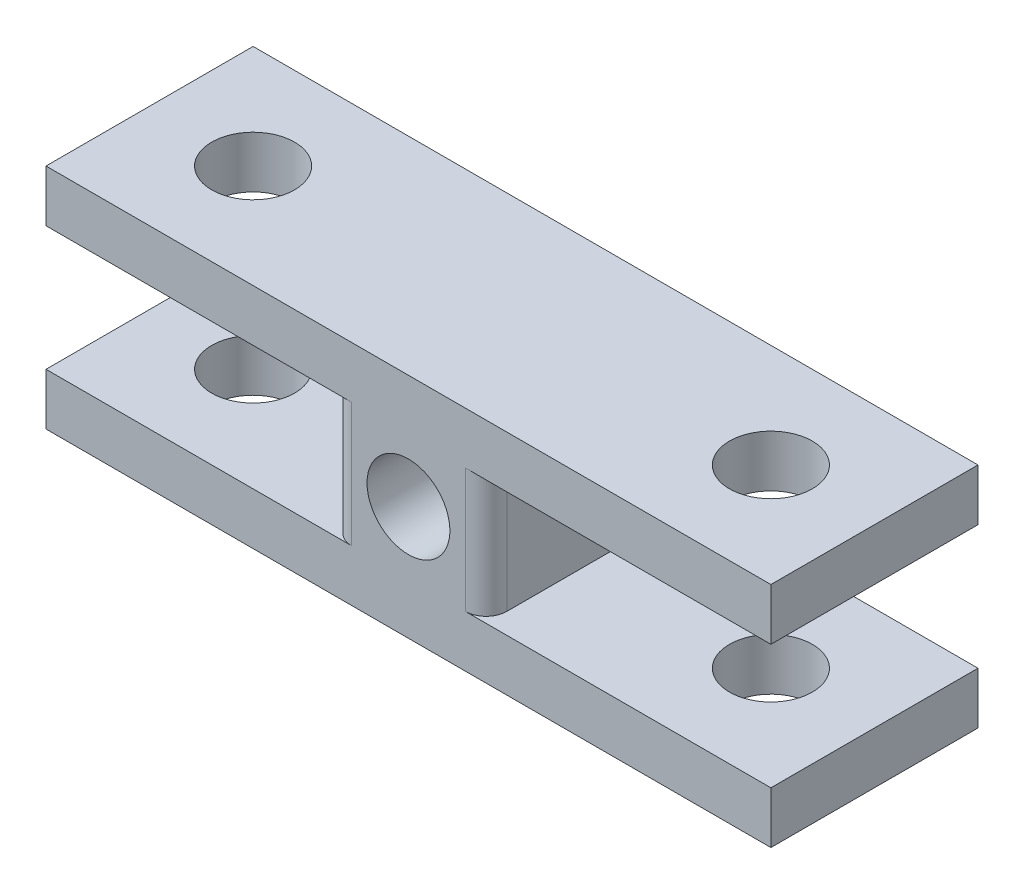
ISO-10303-21;
HEADER;
FILE_DESCRIPTION(('STEP AP214'),'2;1');
FILE_NAME('part.step','',(''),(''),'','','');
FILE_SCHEMA(('AUTOMOTIVE_DESIGN { 1 0 10303 214 1 1 1 1 }'));
ENDSEC;
DATA;
#1=APPLICATION_CONTEXT('core data for automotive mechanical design processes');
#2=APPLICATION_PROTOCOL_DEFINITION('international standard','automotive_design',2000,#1);
#3=PRODUCT_CONTEXT('',#1,'mechanical');
#4=PRODUCT('Part','Part','',(#3));
#5=PRODUCT_RELATED_PRODUCT_CATEGORY('part','',(#4));
#6=PRODUCT_DEFINITION_FORMATION('','',#4);
#7=PRODUCT_DEFINITION_CONTEXT('part definition',#1,'design');
#8=PRODUCT_DEFINITION('design','',#6,#7);
#9=PRODUCT_DEFINITION_SHAPE('','',#8);
#10=(LENGTH_UNIT() NAMED_UNIT(*) SI_UNIT(.MILLI.,.METRE.));
#11=(NAMED_UNIT(*) PLANE_ANGLE_UNIT() SI_UNIT($,.RADIAN.));
#12=(NAMED_UNIT(*) SI_UNIT($,.STERADIAN.) SOLID_ANGLE_UNIT());
#13=UNCERTAINTY_MEASURE_WITH_UNIT(LENGTH_MEASURE(1.E-05),#10,'distance_accuracy_value','');
#14=(GEOMETRIC_REPRESENTATION_CONTEXT(3) GLOBAL_UNCERTAINTY_ASSIGNED_CONTEXT((#13)) GLOBAL_UNIT_ASSIGNED_CONTEXT((#10,
#11,#12)) REPRESENTATION_CONTEXT('',''));
#15=CARTESIAN_POINT('',(0.,0.,0.));
#16=DIRECTION('',(0.,0.,1.));
#17=DIRECTION('',(1.,0.,0.));
#18=AXIS2_PLACEMENT_3D('',#15,#16,#17);
#19=CARTESIAN_POINT('',(0.,5.,0.));
#20=DIRECTION('',(0.,1.,0.));
#21=DIRECTION('',(0.,0.,1.));
#22=AXIS2_PLACEMENT_3D('',#19,#20,#21);
#23=PLANE('',#22);
#24=DIRECTION('',(0.,0.,-1.));
#25=VECTOR('',#24,1.);
#26=CARTESIAN_POINT('',(7.5,5.,10.));
#27=LINE('',#26,#25);
#28=CARTESIAN_POINT('',(7.5,5.,8.));
#29=VERTEX_POINT('',#28);
#30=CARTESIAN_POINT('',(7.5,5.,-8.));
#31=VERTEX_POINT('',#30);
#32=EDGE_CURVE('E222',#29,#31,#27,.T.);
#33=ORIENTED_EDGE('',*,*,#32,.F.);
#34=CARTESIAN_POINT('',(5.5,5.,8.));
#35=DIRECTION('',(0.,1.,0.));
#36=DIRECTION('',(0.,0.,1.));
#37=AXIS2_PLACEMENT_3D('',#34,#35,#36);
#38=CIRCLE('',#37,2.);
#39=CARTESIAN_POINT('',(5.5,5.,10.));
#40=VERTEX_POINT('',#39);
#41=EDGE_CURVE('E322',#29,#40,#38,.F.);
#42=ORIENTED_EDGE('',*,*,#41,.T.);
#43=DIRECTION('',(1.,0.,0.));
#44=VECTOR('',#43,1.);
#45=CARTESIAN_POINT('',(-35.,5.,10.));
#46=LINE('',#45,#44);
#47=CARTESIAN_POINT('',(35.,5.,10.));
#48=VERTEX_POINT('',#47);
#49=EDGE_CURVE('E258',#40,#48,#46,.T.);
#50=ORIENTED_EDGE('',*,*,#49,.T.);
#51=DIRECTION('',(0.,0.,-1.));
#52=VECTOR('',#51,1.);
#53=CARTESIAN_POINT('',(35.,5.,-10.));
#54=LINE('',#53,#52);
#55=CARTESIAN_POINT('',(35.,5.,-10.));
#56=VERTEX_POINT('',#55);
#57=EDGE_CURVE('E247',#48,#56,#54,.T.);
#58=ORIENTED_EDGE('',*,*,#57,.T.);
#59=DIRECTION('',(-1.,0.,0.));
#60=VECTOR('',#59,1.);
#61=CARTESIAN_POINT('',(-35.,5.,-10.));
#62=LINE('',#61,#60);
#63=CARTESIAN_POINT('',(5.5,5.,-10.));
#64=VERTEX_POINT('',#63);
#65=EDGE_CURVE('E252',#56,#64,#62,.T.);
#66=ORIENTED_EDGE('',*,*,#65,.T.);
#67=CARTESIAN_POINT('',(5.5,5.,-8.));
#68=DIRECTION('',(0.,1.,0.));
#69=DIRECTION('',(0.,0.,1.));
#70=AXIS2_PLACEMENT_3D('',#67,#68,#69);
#71=CIRCLE('',#70,2.);
#72=EDGE_CURVE('E47',#64,#31,#71,.F.);
#73=ORIENTED_EDGE('',*,*,#72,.T.);
#74=EDGE_LOOP('',(#33,#42,#50,#58,#66,#73));
#75=FACE_BOUND('',#74,.T.);
#76=CARTESIAN_POINT('',(25.,5.,0.));
#77=DIRECTION('',(0.,1.,0.));
#78=DIRECTION('',(0.,0.,-1.));
#79=AXIS2_PLACEMENT_3D('',#76,#77,#78);
#80=CIRCLE('',#79,4.);
#81=CARTESIAN_POINT('',(25.,5.,-4.));
#82=VERTEX_POINT('',#81);
#83=EDGE_CURVE('E231',#82,#82,#80,.T.);
#84=ORIENTED_EDGE('',*,*,#83,.F.);
#85=EDGE_LOOP('',(#84));
#86=FACE_BOUND('',#85,.T.);
#87=ADVANCED_FACE('F38',(#75,#86),#23,.T.);
#88=DIRECTION('',(0.,0.,1.));
#89=VECTOR('',#88,1.);
#90=CARTESIAN_POINT('',(-7.5,5.,10.));
#91=LINE('',#90,#89);
#92=CARTESIAN_POINT('',(-7.5,5.,-8.));
#93=VERTEX_POINT('',#92);
#94=CARTESIAN_POINT('',(-7.5,5.,8.));
#95=VERTEX_POINT('',#94);
#96=EDGE_CURVE('E226',#93,#95,#91,.T.);
#97=ORIENTED_EDGE('',*,*,#96,.F.);
#98=CARTESIAN_POINT('',(-5.5,5.,-8.));
#99=DIRECTION('',(0.,1.,0.));
#100=DIRECTION('',(0.,0.,1.));
#101=AXIS2_PLACEMENT_3D('',#98,#99,#100);
#102=CIRCLE('',#101,2.);
#103=CARTESIAN_POINT('',(-5.5,5.,-10.));
#104=VERTEX_POINT('',#103);
#105=EDGE_CURVE('E329',#93,#104,#102,.F.);
#106=ORIENTED_EDGE('',*,*,#105,.T.);
#107=CARTESIAN_POINT('',(-35.,5.,-10.));
#108=VERTEX_POINT('',#107);
#109=EDGE_CURVE('E54',#104,#108,#62,.T.);
#110=ORIENTED_EDGE('',*,*,#109,.T.);
#111=DIRECTION('',(0.,0.,1.));
#112=VECTOR('',#111,1.);
#113=CARTESIAN_POINT('',(-35.,5.,-10.));
#114=LINE('',#113,#112);
#115=CARTESIAN_POINT('',(-35.,5.,10.));
#116=VERTEX_POINT('',#115);
#117=EDGE_CURVE('E255',#108,#116,#114,.T.);
#118=ORIENTED_EDGE('',*,*,#117,.T.);
#119=CARTESIAN_POINT('',(-5.5,5.,10.));
#120=VERTEX_POINT('',#119);
#121=EDGE_CURVE('E259',#116,#120,#46,.T.);
#122=ORIENTED_EDGE('',*,*,#121,.T.);
#123=CARTESIAN_POINT('',(-5.5,5.,8.));
#124=DIRECTION('',(0.,1.,0.));
#125=DIRECTION('',(0.,0.,1.));
#126=AXIS2_PLACEMENT_3D('',#123,#124,#125);
#127=CIRCLE('',#126,2.);
#128=EDGE_CURVE('E315',#120,#95,#127,.F.);
#129=ORIENTED_EDGE('',*,*,#128,.T.);
#130=EDGE_LOOP('',(#97,#106,#110,#118,#122,#129));
#131=FACE_BOUND('',#130,.T.);
#132=CARTESIAN_POINT('',(-25.,5.,0.));
#133=DIRECTION('',(0.,1.,0.));
#134=DIRECTION('',(0.,0.,1.));
#135=AXIS2_PLACEMENT_3D('',#132,#133,#134);
#136=CIRCLE('',#135,4.);
#137=CARTESIAN_POINT('',(-25.,5.,4.));
#138=VERTEX_POINT('',#137);
#139=EDGE_CURVE('E239',#138,#138,#136,.T.);
#140=ORIENTED_EDGE('',*,*,#139,.F.);
#141=EDGE_LOOP('',(#140));
#142=FACE_BOUND('',#141,.T.);
#143=ADVANCED_FACE('F375',(#131,#142),#23,.T.);
#144=CARTESIAN_POINT('',(0.,0.,0.));
#145=DIRECTION('',(0.,1.,0.));
#146=DIRECTION('',(0.,0.,1.));
#147=AXIS2_PLACEMENT_3D('',#144,#145,#146);
#148=PLANE('',#147);
#149=DIRECTION('',(0.,0.,-1.));
#150=VECTOR('',#149,1.);
#151=CARTESIAN_POINT('',(35.,0.,-10.));
#152=LINE('',#151,#150);
#153=CARTESIAN_POINT('',(35.,0.,10.));
#154=VERTEX_POINT('',#153);
#155=CARTESIAN_POINT('',(35.,0.,-10.));
#156=VERTEX_POINT('',#155);
#157=EDGE_CURVE('E243',#154,#156,#152,.T.);
#158=ORIENTED_EDGE('',*,*,#157,.F.);
#159=DIRECTION('',(1.,0.,0.));
#160=VECTOR('',#159,1.);
#161=CARTESIAN_POINT('',(-35.,0.,10.));
#162=LINE('',#161,#160);
#163=CARTESIAN_POINT('',(-35.,0.,10.));
#164=VERTEX_POINT('',#163);
#165=EDGE_CURVE('E251',#164,#154,#162,.T.);
#166=ORIENTED_EDGE('',*,*,#165,.F.);
#167=DIRECTION('',(0.,0.,1.));
#168=VECTOR('',#167,1.);
#169=CARTESIAN_POINT('',(-35.,0.,-10.));
#170=LINE('',#169,#168);
#171=CARTESIAN_POINT('',(-35.,0.,-10.));
#172=VERTEX_POINT('',#171);
#173=EDGE_CURVE('E269',#172,#164,#170,.T.);
#174=ORIENTED_EDGE('',*,*,#173,.F.);
#175=DIRECTION('',(-1.,0.,0.));
#176=VECTOR('',#175,1.);
#177=CARTESIAN_POINT('',(-35.,0.,-10.));
#178=LINE('',#177,#176);
#179=EDGE_CURVE('E266',#156,#172,#178,.T.);
#180=ORIENTED_EDGE('',*,*,#179,.F.);
#181=EDGE_LOOP('',(#158,#166,#174,#180));
#182=FACE_BOUND('',#181,.T.);
#183=CARTESIAN_POINT('',(-25.,0.,0.));
#184=DIRECTION('',(0.,1.,0.));
#185=DIRECTION('',(0.,0.,1.));
#186=AXIS2_PLACEMENT_3D('',#183,#184,#185);
#187=CIRCLE('',#186,4.);
#188=CARTESIAN_POINT('',(-25.,0.,4.));
#189=VERTEX_POINT('',#188);
#190=EDGE_CURVE('E235',#189,#189,#187,.T.);
#191=ORIENTED_EDGE('',*,*,#190,.T.);
#192=EDGE_LOOP('',(#191));
#193=FACE_BOUND('',#192,.T.);
#194=CARTESIAN_POINT('',(25.,0.,0.));
#195=DIRECTION('',(0.,1.,0.));
#196=DIRECTION('',(0.,0.,-1.));
#197=AXIS2_PLACEMENT_3D('',#194,#195,#196);
#198=CIRCLE('',#197,4.);
#199=CARTESIAN_POINT('',(25.,0.,-4.));
#200=VERTEX_POINT('',#199);
#201=EDGE_CURVE('E230',#200,#200,#198,.T.);
#202=ORIENTED_EDGE('',*,*,#201,.T.);
#203=EDGE_LOOP('',(#202));
#204=FACE_BOUND('',#203,.T.);
#205=ADVANCED_FACE('F405',(#182,#193,#204),#148,.F.);
#206=CARTESIAN_POINT('',(35.,5.,-10.));
#207=DIRECTION('',(-1.,0.,0.));
#208=DIRECTION('',(0.,0.,1.));
#209=AXIS2_PLACEMENT_3D('',#206,#207,#208);
#210=PLANE('',#209);
#211=ORIENTED_EDGE('',*,*,#157,.T.);
#212=DIRECTION('',(0.,-1.,0.));
#213=VECTOR('',#212,1.);
#214=CARTESIAN_POINT('',(35.,5.,-10.));
#215=LINE('',#214,#213);
#216=EDGE_CURVE('E285',#56,#156,#215,.T.);
#217=ORIENTED_EDGE('',*,*,#216,.F.);
#218=ORIENTED_EDGE('',*,*,#57,.F.);
#219=DIRECTION('',(0.,-1.,0.));
#220=VECTOR('',#219,1.);
#221=CARTESIAN_POINT('',(35.,5.,10.));
#222=LINE('',#221,#220);
#223=EDGE_CURVE('E262',#48,#154,#222,.T.);
#224=ORIENTED_EDGE('',*,*,#223,.T.);
#225=EDGE_LOOP('',(#211,#217,#218,#224));
#226=FACE_BOUND('',#225,.T.);
#227=ADVANCED_FACE('F356',(#226),#210,.F.);
#228=CARTESIAN_POINT('',(-35.,5.,-10.));
#229=DIRECTION('',(0.,0.,1.));
#230=DIRECTION('',(1.,0.,0.));
#231=AXIS2_PLACEMENT_3D('',#228,#229,#230);
#232=PLANE('',#231);
#233=CARTESIAN_POINT('',(0.,11.,-10.));
#234=DIRECTION('',(0.,0.,-1.));
#235=DIRECTION('',(-1.,0.,0.));
#236=AXIS2_PLACEMENT_3D('',#233,#234,#235);
#237=CIRCLE('',#236,4.);
#238=CARTESIAN_POINT('',(-4.,11.,-10.));
#239=VERTEX_POINT('',#238);
#240=EDGE_CURVE('E629',#239,#239,#237,.T.);
#241=ORIENTED_EDGE('',*,*,#240,.F.);
#242=EDGE_LOOP('',(#241));
#243=FACE_BOUND('',#242,.T.);
#244=ORIENTED_EDGE('',*,*,#109,.F.);
#245=DIRECTION('',(0.,-1.,0.));
#246=VECTOR('',#245,1.);
#247=CARTESIAN_POINT('',(-5.5,5.,-10.));
#248=LINE('',#247,#246);
#249=CARTESIAN_POINT('',(-5.5,17.,-10.));
#250=VERTEX_POINT('',#249);
#251=EDGE_CURVE('E312',#104,#250,#248,.F.);
#252=ORIENTED_EDGE('',*,*,#251,.T.);
#253=DIRECTION('',(-1.,0.,0.));
#254=VECTOR('',#253,1.);
#255=CARTESIAN_POINT('',(-35.,17.,-10.));
#256=LINE('',#255,#254);
#257=CARTESIAN_POINT('',(-35.,17.,-10.));
#258=VERTEX_POINT('',#257);
#259=EDGE_CURVE('E62',#250,#258,#256,.T.);
#260=ORIENTED_EDGE('',*,*,#259,.T.);
#261=DIRECTION('',(0.,1.,0.));
#262=VECTOR('',#261,1.);
#263=CARTESIAN_POINT('',(-35.,17.,-10.));
#264=LINE('',#263,#262);
#265=CARTESIAN_POINT('',(-35.,22.,-10.));
#266=VERTEX_POINT('',#265);
#267=EDGE_CURVE('E210',#258,#266,#264,.T.);
#268=ORIENTED_EDGE('',*,*,#267,.T.);
#269=DIRECTION('',(-1.,0.,0.));
#270=VECTOR('',#269,1.);
#271=CARTESIAN_POINT('',(-35.,22.,-10.));
#272=LINE('',#271,#270);
#273=CARTESIAN_POINT('',(35.,22.,-10.));
#274=VERTEX_POINT('',#273);
#275=EDGE_CURVE('E181',#274,#266,#272,.T.);
#276=ORIENTED_EDGE('',*,*,#275,.F.);
#277=DIRECTION('',(0.,1.,0.));
#278=VECTOR('',#277,1.);
#279=CARTESIAN_POINT('',(35.,17.,-10.));
#280=LINE('',#279,#278);
#281=CARTESIAN_POINT('',(35.,17.,-10.));
#282=VERTEX_POINT('',#281);
#283=EDGE_CURVE('E198',#282,#274,#280,.T.);
#284=ORIENTED_EDGE('',*,*,#283,.F.);
#285=CARTESIAN_POINT('',(5.5,17.,-10.));
#286=VERTEX_POINT('',#285);
#287=EDGE_CURVE('E179',#282,#286,#256,.T.);
#288=ORIENTED_EDGE('',*,*,#287,.T.);
#289=DIRECTION('',(0.,-1.,0.));
#290=VECTOR('',#289,1.);
#291=CARTESIAN_POINT('',(5.5,5.,-10.));
#292=LINE('',#291,#290);
#293=EDGE_CURVE('E308',#286,#64,#292,.T.);
#294=ORIENTED_EDGE('',*,*,#293,.T.);
#295=ORIENTED_EDGE('',*,*,#65,.F.);
#296=ORIENTED_EDGE('',*,*,#216,.T.);
#297=ORIENTED_EDGE('',*,*,#179,.T.);
#298=DIRECTION('',(0.,-1.,0.));
#299=VECTOR('',#298,1.);
#300=CARTESIAN_POINT('',(-35.,5.,-10.));
#301=LINE('',#300,#299);
#302=EDGE_CURVE('E281',#108,#172,#301,.T.);
#303=ORIENTED_EDGE('',*,*,#302,.F.);
#304=EDGE_LOOP('',(#244,#252,#260,#268,#276,#284,#288,#294,#295,#296,#297,#303));
#305=FACE_BOUND('',#304,.T.);
#306=ADVANCED_FACE('F357',(#243,#305),#232,.F.);
#307=CARTESIAN_POINT('',(-35.,5.,-10.));
#308=DIRECTION('',(1.,0.,0.));
#309=DIRECTION('',(0.,0.,-1.));
#310=AXIS2_PLACEMENT_3D('',#307,#308,#309);
#311=PLANE('',#310);
#312=ORIENTED_EDGE('',*,*,#173,.T.);
#313=DIRECTION('',(0.,-1.,0.));
#314=VECTOR('',#313,1.);
#315=CARTESIAN_POINT('',(-35.,5.,10.));
#316=LINE('',#315,#314);
#317=EDGE_CURVE('E277',#116,#164,#316,.T.);
#318=ORIENTED_EDGE('',*,*,#317,.F.);
#319=ORIENTED_EDGE('',*,*,#117,.F.);
#320=ORIENTED_EDGE('',*,*,#302,.T.);
#321=EDGE_LOOP('',(#312,#318,#319,#320));
#322=FACE_BOUND('',#321,.T.);
#323=ADVANCED_FACE('F381',(#322),#311,.F.);
#324=CARTESIAN_POINT('',(-35.,5.,10.));
#325=DIRECTION('',(0.,0.,-1.));
#326=DIRECTION('',(-1.,0.,0.));
#327=AXIS2_PLACEMENT_3D('',#324,#325,#326);
#328=PLANE('',#327);
#329=CARTESIAN_POINT('',(0.,11.,10.));
#330=DIRECTION('',(0.,0.,-1.));
#331=DIRECTION('',(-1.,0.,0.));
#332=AXIS2_PLACEMENT_3D('',#329,#330,#331);
#333=CIRCLE('',#332,4.);
#334=CARTESIAN_POINT('',(-4.,11.,10.));
#335=VERTEX_POINT('',#334);
#336=EDGE_CURVE('E626',#335,#335,#333,.T.);
#337=ORIENTED_EDGE('',*,*,#336,.T.);
#338=EDGE_LOOP('',(#337));
#339=FACE_BOUND('',#338,.T.);
#340=DIRECTION('',(0.,-1.,0.));
#341=VECTOR('',#340,1.);
#342=CARTESIAN_POINT('',(-5.5,5.,10.));
#343=LINE('',#342,#341);
#344=CARTESIAN_POINT('',(-5.5,17.,10.));
#345=VERTEX_POINT('',#344);
#346=EDGE_CURVE('E291',#345,#120,#343,.T.);
#347=ORIENTED_EDGE('',*,*,#346,.T.);
#348=ORIENTED_EDGE('',*,*,#121,.F.);
#349=ORIENTED_EDGE('',*,*,#317,.T.);
#350=ORIENTED_EDGE('',*,*,#165,.T.);
#351=ORIENTED_EDGE('',*,*,#223,.F.);
#352=ORIENTED_EDGE('',*,*,#49,.F.);
#353=DIRECTION('',(0.,-1.,0.));
#354=VECTOR('',#353,1.);
#355=CARTESIAN_POINT('',(5.5,5.,10.));
#356=LINE('',#355,#354);
#357=CARTESIAN_POINT('',(5.5,17.,10.));
#358=VERTEX_POINT('',#357);
#359=EDGE_CURVE('E159',#40,#358,#356,.F.);
#360=ORIENTED_EDGE('',*,*,#359,.T.);
#361=DIRECTION('',(1.,0.,0.));
#362=VECTOR('',#361,1.);
#363=CARTESIAN_POINT('',(-35.,17.,10.));
#364=LINE('',#363,#362);
#365=CARTESIAN_POINT('',(35.,17.,10.));
#366=VERTEX_POINT('',#365);
#367=EDGE_CURVE('E151',#358,#366,#364,.T.);
#368=ORIENTED_EDGE('',*,*,#367,.T.);
#369=DIRECTION('',(0.,1.,0.));
#370=VECTOR('',#369,1.);
#371=CARTESIAN_POINT('',(35.,17.,10.));
#372=LINE('',#371,#370);
#373=CARTESIAN_POINT('',(35.,22.,10.));
#374=VERTEX_POINT('',#373);
#375=EDGE_CURVE('E156',#366,#374,#372,.T.);
#376=ORIENTED_EDGE('',*,*,#375,.T.);
#377=DIRECTION('',(1.,0.,0.));
#378=VECTOR('',#377,1.);
#379=CARTESIAN_POINT('',(-35.,22.,10.));
#380=LINE('',#379,#378);
#381=CARTESIAN_POINT('',(-35.,22.,10.));
#382=VERTEX_POINT('',#381);
#383=EDGE_CURVE('E201',#382,#374,#380,.T.);
#384=ORIENTED_EDGE('',*,*,#383,.F.);
#385=DIRECTION('',(0.,1.,0.));
#386=VECTOR('',#385,1.);
#387=CARTESIAN_POINT('',(-35.,17.,10.));
#388=LINE('',#387,#386);
#389=CARTESIAN_POINT('',(-35.,17.,10.));
#390=VERTEX_POINT('',#389);
#391=EDGE_CURVE('E176',#390,#382,#388,.T.);
#392=ORIENTED_EDGE('',*,*,#391,.F.);
#393=EDGE_CURVE('E164',#390,#345,#364,.T.);
#394=ORIENTED_EDGE('',*,*,#393,.T.);
#395=EDGE_LOOP('',(#347,#348,#349,#350,#351,#352,#360,#368,#376,#384,#392,#394));
#396=FACE_BOUND('',#395,.T.);
#397=ADVANCED_FACE('F154',(#339,#396),#328,.F.);
#398=CARTESIAN_POINT('',(-25.,5.,0.));
#399=DIRECTION('',(0.,-1.,0.));
#400=DIRECTION('',(0.,0.,-1.));
#401=AXIS2_PLACEMENT_3D('',#398,#399,#400);
#402=CYLINDRICAL_SURFACE('',#401,4.);
#403=ORIENTED_EDGE('',*,*,#139,.T.);
#404=EDGE_LOOP('',(#403));
#405=FACE_BOUND('',#404,.T.);
#406=ORIENTED_EDGE('',*,*,#190,.F.);
#407=EDGE_LOOP('',(#406));
#408=FACE_BOUND('',#407,.T.);
#409=ADVANCED_FACE('F408',(#405,#408),#402,.F.);
#410=CARTESIAN_POINT('',(25.,5.,0.));
#411=DIRECTION('',(0.,-1.,0.));
#412=DIRECTION('',(0.,0.,-1.));
#413=AXIS2_PLACEMENT_3D('',#410,#411,#412);
#414=CYLINDRICAL_SURFACE('',#413,4.);
#415=ORIENTED_EDGE('',*,*,#83,.T.);
#416=EDGE_LOOP('',(#415));
#417=FACE_BOUND('',#416,.T.);
#418=ORIENTED_EDGE('',*,*,#201,.F.);
#419=EDGE_LOOP('',(#418));
#420=FACE_BOUND('',#419,.T.);
#421=ADVANCED_FACE('F455',(#417,#420),#414,.F.);
#422=CARTESIAN_POINT('',(7.5,11.,10.));
#423=DIRECTION('',(-1.,0.,0.));
#424=DIRECTION('',(0.,0.,1.));
#425=AXIS2_PLACEMENT_3D('',#422,#423,#424);
#426=PLANE('',#425);
#427=DIRECTION('',(0.,0.,-1.));
#428=VECTOR('',#427,1.);
#429=CARTESIAN_POINT('',(7.5,17.,10.));
#430=LINE('',#429,#428);
#431=CARTESIAN_POINT('',(7.5,17.,8.));
#432=VERTEX_POINT('',#431);
#433=CARTESIAN_POINT('',(7.5,17.,-8.));
#434=VERTEX_POINT('',#433);
#435=EDGE_CURVE('E175',#432,#434,#430,.T.);
#436=ORIENTED_EDGE('',*,*,#435,.F.);
#437=DIRECTION('',(0.,-1.,0.));
#438=VECTOR('',#437,1.);
#439=CARTESIAN_POINT('',(7.5,11.,8.));
#440=LINE('',#439,#438);
#441=EDGE_CURVE('E304',#432,#29,#440,.T.);
#442=ORIENTED_EDGE('',*,*,#441,.T.);
#443=ORIENTED_EDGE('',*,*,#32,.T.);
#444=DIRECTION('',(0.,-1.,0.));
#445=VECTOR('',#444,1.);
#446=CARTESIAN_POINT('',(7.5,11.,-8.));
#447=LINE('',#446,#445);
#448=EDGE_CURVE('E301',#31,#434,#447,.F.);
#449=ORIENTED_EDGE('',*,*,#448,.T.);
#450=EDGE_LOOP('',(#436,#442,#443,#449));
#451=FACE_BOUND('',#450,.T.);
#452=ADVANCED_FACE('F344',(#451),#426,.F.);
#453=CARTESIAN_POINT('',(-7.5,11.,10.));
#454=DIRECTION('',(1.,0.,0.));
#455=DIRECTION('',(0.,0.,-1.));
#456=AXIS2_PLACEMENT_3D('',#453,#454,#455);
#457=PLANE('',#456);
#458=ORIENTED_EDGE('',*,*,#96,.T.);
#459=DIRECTION('',(0.,-1.,0.));
#460=VECTOR('',#459,1.);
#461=CARTESIAN_POINT('',(-7.5,11.,8.));
#462=LINE('',#461,#460);
#463=CARTESIAN_POINT('',(-7.5,17.,8.));
#464=VERTEX_POINT('',#463);
#465=EDGE_CURVE('E298',#95,#464,#462,.F.);
#466=ORIENTED_EDGE('',*,*,#465,.T.);
#467=DIRECTION('',(0.,0.,1.));
#468=VECTOR('',#467,1.);
#469=CARTESIAN_POINT('',(-7.5,17.,10.));
#470=LINE('',#469,#468);
#471=CARTESIAN_POINT('',(-7.5,17.,-8.));
#472=VERTEX_POINT('',#471);
#473=EDGE_CURVE('E218',#472,#464,#470,.T.);
#474=ORIENTED_EDGE('',*,*,#473,.F.);
#475=DIRECTION('',(0.,-1.,0.));
#476=VECTOR('',#475,1.);
#477=CARTESIAN_POINT('',(-7.5,11.,-8.));
#478=LINE('',#477,#476);
#479=EDGE_CURVE('E294',#472,#93,#478,.T.);
#480=ORIENTED_EDGE('',*,*,#479,.T.);
#481=EDGE_LOOP('',(#458,#466,#474,#480));
#482=FACE_BOUND('',#481,.T.);
#483=ADVANCED_FACE('F389',(#482),#457,.F.);
#484=CARTESIAN_POINT('',(0.,17.,0.));
#485=DIRECTION('',(0.,-1.,0.));
#486=DIRECTION('',(0.,0.,1.));
#487=AXIS2_PLACEMENT_3D('',#484,#485,#486);
#488=PLANE('',#487);
#489=CARTESIAN_POINT('',(25.,17.,0.));
#490=DIRECTION('',(0.,1.,0.));
#491=DIRECTION('',(0.,0.,-1.));
#492=AXIS2_PLACEMENT_3D('',#489,#490,#491);
#493=CIRCLE('',#492,4.);
#494=CARTESIAN_POINT('',(25.,17.,-4.));
#495=VERTEX_POINT('',#494);
#496=EDGE_CURVE('E618',#495,#495,#493,.T.);
#497=ORIENTED_EDGE('',*,*,#496,.T.);
#498=EDGE_LOOP('',(#497));
#499=FACE_BOUND('',#498,.T.);
#500=ORIENTED_EDGE('',*,*,#367,.F.);
#501=CARTESIAN_POINT('',(5.5,17.,8.));
#502=DIRECTION('',(0.,-1.,0.));
#503=DIRECTION('',(0.,0.,-1.));
#504=AXIS2_PLACEMENT_3D('',#501,#502,#503);
#505=CIRCLE('',#504,2.);
#506=EDGE_CURVE('E326',#358,#432,#505,.F.);
#507=ORIENTED_EDGE('',*,*,#506,.T.);
#508=ORIENTED_EDGE('',*,*,#435,.T.);
#509=CARTESIAN_POINT('',(5.5,17.,-8.));
#510=DIRECTION('',(0.,-1.,0.));
#511=DIRECTION('',(0.,0.,-1.));
#512=AXIS2_PLACEMENT_3D('',#509,#510,#511);
#513=CIRCLE('',#512,2.);
#514=EDGE_CURVE('E11',#434,#286,#513,.F.);
#515=ORIENTED_EDGE('',*,*,#514,.T.);
#516=ORIENTED_EDGE('',*,*,#287,.F.);
#517=DIRECTION('',(0.,0.,-1.));
#518=VECTOR('',#517,1.);
#519=CARTESIAN_POINT('',(35.,17.,-10.));
#520=LINE('',#519,#518);
#521=EDGE_CURVE('E165',#366,#282,#520,.T.);
#522=ORIENTED_EDGE('',*,*,#521,.F.);
#523=EDGE_LOOP('',(#500,#507,#508,#515,#516,#522));
#524=FACE_BOUND('',#523,.T.);
#525=ADVANCED_FACE('F178',(#499,#524),#488,.T.);
#526=CARTESIAN_POINT('',(35.,17.,-10.));
#527=DIRECTION('',(1.,0.,0.));
#528=DIRECTION('',(0.,0.,-1.));
#529=AXIS2_PLACEMENT_3D('',#526,#527,#528);
#530=PLANE('',#529);
#531=DIRECTION('',(0.,0.,-1.));
#532=VECTOR('',#531,1.);
#533=CARTESIAN_POINT('',(35.,22.,-10.));
#534=LINE('',#533,#532);
#535=EDGE_CURVE('E172',#374,#274,#534,.T.);
#536=ORIENTED_EDGE('',*,*,#535,.F.);
#537=ORIENTED_EDGE('',*,*,#375,.F.);
#538=ORIENTED_EDGE('',*,*,#521,.T.);
#539=ORIENTED_EDGE('',*,*,#283,.T.);
#540=EDGE_LOOP('',(#536,#537,#538,#539));
#541=FACE_BOUND('',#540,.T.);
#542=ADVANCED_FACE('F169',(#541),#530,.T.);
#543=CARTESIAN_POINT('',(-35.,17.,-10.));
#544=DIRECTION('',(-1.,0.,0.));
#545=DIRECTION('',(0.,0.,1.));
#546=AXIS2_PLACEMENT_3D('',#543,#544,#545);
#547=PLANE('',#546);
#548=DIRECTION('',(0.,0.,1.));
#549=VECTOR('',#548,1.);
#550=CARTESIAN_POINT('',(-35.,22.,-10.));
#551=LINE('',#550,#549);
#552=EDGE_CURVE('E185',#266,#382,#551,.T.);
#553=ORIENTED_EDGE('',*,*,#552,.F.);
#554=ORIENTED_EDGE('',*,*,#267,.F.);
#555=DIRECTION('',(0.,0.,1.));
#556=VECTOR('',#555,1.);
#557=CARTESIAN_POINT('',(-35.,17.,-10.));
#558=LINE('',#557,#556);
#559=EDGE_CURVE('E192',#258,#390,#558,.T.);
#560=ORIENTED_EDGE('',*,*,#559,.T.);
#561=ORIENTED_EDGE('',*,*,#391,.T.);
#562=EDGE_LOOP('',(#553,#554,#560,#561));
#563=FACE_BOUND('',#562,.T.);
#564=ADVANCED_FACE('F368',(#563),#547,.T.);
#565=CARTESIAN_POINT('',(-25.,17.,0.));
#566=DIRECTION('',(0.,1.,0.));
#567=DIRECTION('',(0.,0.,1.));
#568=AXIS2_PLACEMENT_3D('',#565,#566,#567);
#569=CIRCLE('',#568,4.);
#570=CARTESIAN_POINT('',(-25.,17.,4.));
#571=VERTEX_POINT('',#570);
#572=EDGE_CURVE('E202',#571,#571,#569,.T.);
#573=ORIENTED_EDGE('',*,*,#572,.T.);
#574=EDGE_LOOP('',(#573));
#575=FACE_BOUND('',#574,.T.);
#576=ORIENTED_EDGE('',*,*,#259,.F.);
#577=CARTESIAN_POINT('',(-5.5,17.,-8.));
#578=DIRECTION('',(0.,-1.,0.));
#579=DIRECTION('',(0.,0.,-1.));
#580=AXIS2_PLACEMENT_3D('',#577,#578,#579);
#581=CIRCLE('',#580,2.);
#582=EDGE_CURVE('E332',#250,#472,#581,.F.);
#583=ORIENTED_EDGE('',*,*,#582,.T.);
#584=ORIENTED_EDGE('',*,*,#473,.T.);
#585=CARTESIAN_POINT('',(-5.5,17.,8.));
#586=DIRECTION('',(0.,-1.,0.));
#587=DIRECTION('',(0.,0.,-1.));
#588=AXIS2_PLACEMENT_3D('',#585,#586,#587);
#589=CIRCLE('',#588,2.);
#590=EDGE_CURVE('E318',#464,#345,#589,.F.);
#591=ORIENTED_EDGE('',*,*,#590,.T.);
#592=ORIENTED_EDGE('',*,*,#393,.F.);
#593=ORIENTED_EDGE('',*,*,#559,.F.);
#594=EDGE_LOOP('',(#576,#583,#584,#591,#592,#593));
#595=FACE_BOUND('',#594,.T.);
#596=ADVANCED_FACE('F364',(#575,#595),#488,.T.);
#597=CARTESIAN_POINT('',(0.,22.,0.));
#598=DIRECTION('',(0.,-1.,0.));
#599=DIRECTION('',(0.,0.,1.));
#600=AXIS2_PLACEMENT_3D('',#597,#598,#599);
#601=PLANE('',#600);
#602=CARTESIAN_POINT('',(25.,22.,0.));
#603=DIRECTION('',(0.,1.,0.));
#604=DIRECTION('',(0.,0.,-1.));
#605=AXIS2_PLACEMENT_3D('',#602,#603,#604);
#606=CIRCLE('',#605,4.);
#607=CARTESIAN_POINT('',(25.,22.,-4.));
#608=VERTEX_POINT('',#607);
#609=EDGE_CURVE('E620',#608,#608,#606,.T.);
#610=ORIENTED_EDGE('',*,*,#609,.F.);
#611=EDGE_LOOP('',(#610));
#612=FACE_BOUND('',#611,.T.);
#613=CARTESIAN_POINT('',(-25.,22.,0.));
#614=DIRECTION('',(0.,1.,0.));
#615=DIRECTION('',(0.,0.,1.));
#616=AXIS2_PLACEMENT_3D('',#613,#614,#615);
#617=CIRCLE('',#616,4.);
#618=CARTESIAN_POINT('',(-25.,22.,4.));
#619=VERTEX_POINT('',#618);
#620=EDGE_CURVE('E188',#619,#619,#617,.T.);
#621=ORIENTED_EDGE('',*,*,#620,.F.);
#622=EDGE_LOOP('',(#621));
#623=FACE_BOUND('',#622,.T.);
#624=ORIENTED_EDGE('',*,*,#535,.T.);
#625=ORIENTED_EDGE('',*,*,#275,.T.);
#626=ORIENTED_EDGE('',*,*,#552,.T.);
#627=ORIENTED_EDGE('',*,*,#383,.T.);
#628=EDGE_LOOP('',(#624,#625,#626,#627));
#629=FACE_BOUND('',#628,.T.);
#630=ADVANCED_FACE('F360',(#612,#623,#629),#601,.F.);
#631=CARTESIAN_POINT('',(-25.,17.,0.));
#632=DIRECTION('',(0.,1.,0.));
#633=DIRECTION('',(0.,0.,1.));
#634=AXIS2_PLACEMENT_3D('',#631,#632,#633);
#635=CYLINDRICAL_SURFACE('',#634,4.);
#636=ORIENTED_EDGE('',*,*,#572,.F.);
#637=EDGE_LOOP('',(#636));
#638=FACE_BOUND('',#637,.T.);
#639=ORIENTED_EDGE('',*,*,#620,.T.);
#640=EDGE_LOOP('',(#639));
#641=FACE_BOUND('',#640,.T.);
#642=ADVANCED_FACE('F433',(#638,#641),#635,.F.);
#643=CARTESIAN_POINT('',(25.,17.,0.));
#644=DIRECTION('',(0.,1.,0.));
#645=DIRECTION('',(0.,0.,1.));
#646=AXIS2_PLACEMENT_3D('',#643,#644,#645);
#647=CYLINDRICAL_SURFACE('',#646,4.);
#648=ORIENTED_EDGE('',*,*,#496,.F.);
#649=EDGE_LOOP('',(#648));
#650=FACE_BOUND('',#649,.T.);
#651=ORIENTED_EDGE('',*,*,#609,.T.);
#652=EDGE_LOOP('',(#651));
#653=FACE_BOUND('',#652,.T.);
#654=ADVANCED_FACE('F428',(#650,#653),#647,.F.);
#655=CARTESIAN_POINT('',(0.,11.,10.));
#656=DIRECTION('',(0.,0.,-1.));
#657=DIRECTION('',(-1.,0.,0.));
#658=AXIS2_PLACEMENT_3D('',#655,#656,#657);
#659=CYLINDRICAL_SURFACE('',#658,4.);
#660=ORIENTED_EDGE('',*,*,#336,.F.);
#661=EDGE_LOOP('',(#660));
#662=FACE_BOUND('',#661,.T.);
#663=ORIENTED_EDGE('',*,*,#240,.T.);
#664=EDGE_LOOP('',(#663));
#665=FACE_BOUND('',#664,.T.);
#666=ADVANCED_FACE('F424',(#662,#665),#659,.F.);
#667=CARTESIAN_POINT('',(-5.5,5.,8.));
#668=DIRECTION('',(0.,-1.,0.));
#669=DIRECTION('',(0.,0.,-1.));
#670=AXIS2_PLACEMENT_3D('',#667,#668,#669);
#671=CYLINDRICAL_SURFACE('',#670,2.);
#672=ORIENTED_EDGE('',*,*,#590,.F.);
#673=ORIENTED_EDGE('',*,*,#465,.F.);
#674=ORIENTED_EDGE('',*,*,#128,.F.);
#675=ORIENTED_EDGE('',*,*,#346,.F.);
#676=EDGE_LOOP('',(#672,#673,#674,#675));
#677=FACE_BOUND('',#676,.T.);
#678=ADVANCED_FACE('F386',(#677),#671,.T.);
#679=CARTESIAN_POINT('',(5.5,11.,8.));
#680=DIRECTION('',(0.,-1.,0.));
#681=DIRECTION('',(0.,0.,-1.));
#682=AXIS2_PLACEMENT_3D('',#679,#680,#681);
#683=CYLINDRICAL_SURFACE('',#682,2.);
#684=ORIENTED_EDGE('',*,*,#506,.F.);
#685=ORIENTED_EDGE('',*,*,#359,.F.);
#686=ORIENTED_EDGE('',*,*,#41,.F.);
#687=ORIENTED_EDGE('',*,*,#441,.F.);
#688=EDGE_LOOP('',(#684,#685,#686,#687));
#689=FACE_BOUND('',#688,.T.);
#690=ADVANCED_FACE('F348',(#689),#683,.T.);
#691=CARTESIAN_POINT('',(-5.5,11.,-8.));
#692=DIRECTION('',(0.,-1.,0.));
#693=DIRECTION('',(0.,0.,-1.));
#694=AXIS2_PLACEMENT_3D('',#691,#692,#693);
#695=CYLINDRICAL_SURFACE('',#694,2.);
#696=ORIENTED_EDGE('',*,*,#582,.F.);
#697=ORIENTED_EDGE('',*,*,#251,.F.);
#698=ORIENTED_EDGE('',*,*,#105,.F.);
#699=ORIENTED_EDGE('',*,*,#479,.F.);
#700=EDGE_LOOP('',(#696,#697,#698,#699));
#701=FACE_BOUND('',#700,.T.);
#702=ADVANCED_FACE('F392',(#701),#695,.T.);
#703=CARTESIAN_POINT('',(5.5,5.,-8.));
#704=DIRECTION('',(0.,-1.,0.));
#705=DIRECTION('',(0.,0.,-1.));
#706=AXIS2_PLACEMENT_3D('',#703,#704,#705);
#707=CYLINDRICAL_SURFACE('',#706,2.);
#708=ORIENTED_EDGE('',*,*,#514,.F.);
#709=ORIENTED_EDGE('',*,*,#448,.F.);
#710=ORIENTED_EDGE('',*,*,#72,.F.);
#711=ORIENTED_EDGE('',*,*,#293,.F.);
#712=EDGE_LOOP('',(#708,#709,#710,#711));
#713=FACE_BOUND('',#712,.T.);
#714=ADVANCED_FACE('F40',(#713),#707,.T.);
#715=CLOSED_SHELL('',(#87,#143,#205,#227,#306,#323,#397,#409,#421,#452,#483,#525,#542,#564,#596,
#630,#642,#654,#666,#678,#690,#702,#714));
#716=MANIFOLD_SOLID_BREP('B2',#715);
#717=ADVANCED_BREP_SHAPE_REPRESENTATION('',(#18,#716),#14);
#718=SHAPE_DEFINITION_REPRESENTATION(#9,#717);
ENDSEC;
END-ISO-10303-21;
